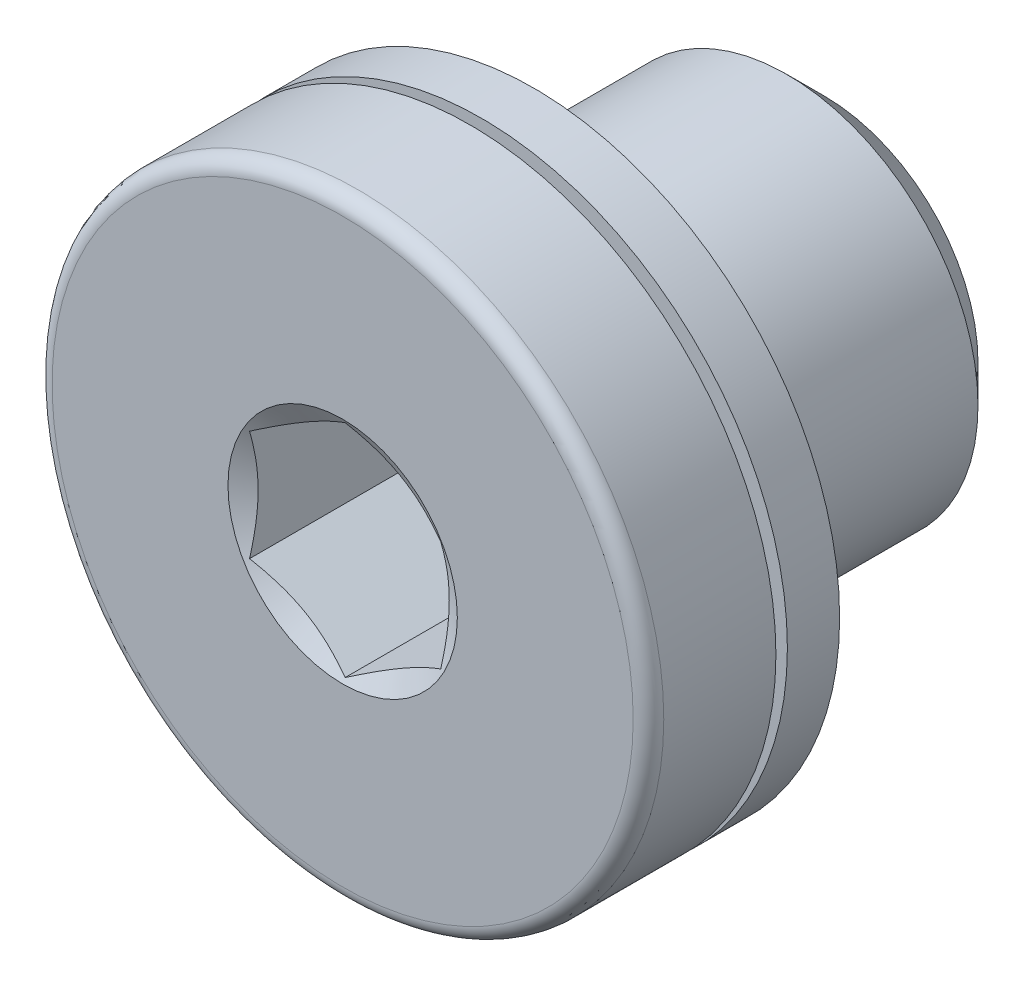
ISO-10303-21;
HEADER;
FILE_DESCRIPTION(('STEP AP214'),'2;1');
FILE_NAME('part.step','',(''),(''),'','','');
FILE_SCHEMA(('AUTOMOTIVE_DESIGN { 1 0 10303 214 1 1 1 1 }'));
ENDSEC;
DATA;
#1=APPLICATION_CONTEXT('core data for automotive mechanical design processes');
#2=APPLICATION_PROTOCOL_DEFINITION('international standard','automotive_design',2000,#1);
#3=PRODUCT_CONTEXT('',#1,'mechanical');
#4=PRODUCT('Part','Part','',(#3));
#5=PRODUCT_RELATED_PRODUCT_CATEGORY('part','',(#4));
#6=PRODUCT_DEFINITION_FORMATION('','',#4);
#7=PRODUCT_DEFINITION_CONTEXT('part definition',#1,'design');
#8=PRODUCT_DEFINITION('design','',#6,#7);
#9=PRODUCT_DEFINITION_SHAPE('','',#8);
#10=(LENGTH_UNIT() NAMED_UNIT(*) SI_UNIT(.MILLI.,.METRE.));
#11=(NAMED_UNIT(*) PLANE_ANGLE_UNIT() SI_UNIT($,.RADIAN.));
#12=(NAMED_UNIT(*) SI_UNIT($,.STERADIAN.) SOLID_ANGLE_UNIT());
#13=UNCERTAINTY_MEASURE_WITH_UNIT(LENGTH_MEASURE(1.E-05),#10,'distance_accuracy_value','');
#14=(GEOMETRIC_REPRESENTATION_CONTEXT(3) GLOBAL_UNCERTAINTY_ASSIGNED_CONTEXT((#13)) GLOBAL_UNIT_ASSIGNED_CONTEXT((#10,
#11,#12)) REPRESENTATION_CONTEXT('',''));
#15=CARTESIAN_POINT('',(0.,0.,0.));
#16=DIRECTION('',(0.,0.,1.));
#17=DIRECTION('',(1.,0.,0.));
#18=AXIS2_PLACEMENT_3D('',#15,#16,#17);
#19=CARTESIAN_POINT('',(0.,0.,2.5));
#20=DIRECTION('',(0.,0.,1.));
#21=DIRECTION('',(1.,0.,0.));
#22=AXIS2_PLACEMENT_3D('',#19,#20,#21);
#23=CONICAL_SURFACE('',#22,1.5,1.04719755119662);
#24=CARTESIAN_POINT('',(0.0002,-1.44349114302794,2.46737460421494));
#25=CARTESIAN_POINT('',(-0.0547333052317653,-1.4117753844649,2.44905384431261));
#26=CARTESIAN_POINT('',(-0.11014078650024,-1.37978586023943,2.43239123574955));
#27=CARTESIAN_POINT('',(-0.221915367600341,-1.31525277575272,2.40330523349468));
#28=CARTESIAN_POINT('',(-0.278284454841711,-1.28270806805994,2.39089213152496));
#29=CARTESIAN_POINT('',(-0.390323974086986,-1.2180220214638,2.37156761718492));
#30=CARTESIAN_POINT('',(-0.445977158459231,-1.18589064048523,2.36452761899634));
#31=CARTESIAN_POINT('',(-0.557545653908394,-1.12147653960457,2.35612036217954));
#32=CARTESIAN_POINT('',(-0.613460558937603,-1.08919405413424,2.35474614475363));
#33=CARTESIAN_POINT('',(-0.717957921181727,-1.02886247391298,2.35759126691683));
#34=CARTESIAN_POINT('',(-0.766555949881317,-1.00080438896119,2.36111202836892));
#35=CARTESIAN_POINT('',(-0.86343536217324,-0.944871034195512,2.37227504224816));
#36=CARTESIAN_POINT('',(-0.911716410192164,-0.916995958125027,2.37992111512158));
#37=CARTESIAN_POINT('',(-1.00879588385404,-0.860947097873551,2.39903738424943));
#38=CARTESIAN_POINT('',(-1.0575820103519,-0.832780414607293,2.41058868652856));
#39=CARTESIAN_POINT('',(-1.1544262522921,-0.776867365453649,2.43680624424279));
#40=CARTESIAN_POINT('',(-1.20248561032696,-0.74912028215514,2.451466331688));
#41=CARTESIAN_POINT('',(-1.2502,-0.721572366433192,2.46737460421492));
#42=B_SPLINE_CURVE_WITH_KNOTS('',3,(#24,#25,#26,#27,#28,#29,#30,#31,#32,#33,#34,#35,#36,#37,#38,
#39,#40,#41),.UNSPECIFIED.,.F.,.F.,(4,2,2,2,2,2,2,2,4),(0.,0.198150821029563,0.396778196315227,
0.59048861735441,0.783961049317196,0.952480056398661,1.12115539730011,1.29357430343591,
1.46565426976932),.UNSPECIFIED.);
#43=CARTESIAN_POINT('',(0.,-1.4433756729741,2.46730792954892));
#44=VERTEX_POINT('',#43);
#45=CARTESIAN_POINT('',(-1.25,-0.72168783648703,2.4673079295489));
#46=VERTEX_POINT('',#45);
#47=EDGE_CURVE('E168',#44,#46,#42,.T.);
#48=ORIENTED_EDGE('',*,*,#47,.T.);
#49=CARTESIAN_POINT('',(-1.25,-1.87874572894168,2.93681578812608));
#50=CARTESIAN_POINT('',(-1.25,-1.82459913302068,2.91079630397451));
#51=CARTESIAN_POINT('',(-1.25,-1.77032166178898,2.88504443226517));
#52=CARTESIAN_POINT('',(-1.25,-1.66143478481926,2.83422768886452));
#53=CARTESIAN_POINT('',(-1.25,-1.60682532215901,2.80916293929029));
#54=CARTESIAN_POINT('',(-1.25,-1.49689322856349,2.75973307534326));
#55=CARTESIAN_POINT('',(-1.25,-1.44156828319314,2.73537308530055));
#56=CARTESIAN_POINT('',(-1.25,-1.33045744440503,2.68773477371074));
#57=CARTESIAN_POINT('',(-1.25,-1.27467157496949,2.66445639629877));
#58=CARTESIAN_POINT('',(-1.25,-1.16103991470961,2.61865938884855));
#59=CARTESIAN_POINT('',(-1.25,-1.10317898167126,2.59617783094599));
#60=CARTESIAN_POINT('',(-1.25,-0.986771125105983,2.55307334414044));
#61=CARTESIAN_POINT('',(-1.25,-0.928224116523322,2.5324506485031));
#62=CARTESIAN_POINT('',(-1.25,-0.751645593411336,2.47423400437964));
#63=CARTESIAN_POINT('',(-1.25,-0.6323555808323,2.44015611590166));
#64=CARTESIAN_POINT('',(-1.25,-0.45116473849796,2.40056175977571));
#65=CARTESIAN_POINT('',(-1.25,-0.390526459363069,2.3892961625641));
#66=CARTESIAN_POINT('',(-1.25,-0.268559609070198,2.37134572474735));
#67=CARTESIAN_POINT('',(-1.25,-0.207231087371658,2.36466055802818));
#68=CARTESIAN_POINT('',(-1.25,-0.084966050685076,2.35648952204454));
#69=CARTESIAN_POINT('',(-1.25,-0.0240337887366344,2.35494164073779));
#70=CARTESIAN_POINT('',(-1.25,0.0977411791636478,2.35701041163861));
#71=CARTESIAN_POINT('',(-1.25,0.158583879563683,2.36062737154196));
#72=CARTESIAN_POINT('',(-1.25,0.308250226749134,2.37555891687979));
#73=CARTESIAN_POINT('',(-1.25,0.396792908586709,2.38969120089228));
#74=CARTESIAN_POINT('',(-1.25,0.57216953082706,2.42625541428785));
#75=CARTESIAN_POINT('',(-1.25,0.65900129656399,2.44869726858717));
#76=CARTESIAN_POINT('',(-1.25,0.788874180686678,2.48708761722013));
#77=CARTESIAN_POINT('',(-1.25,0.832585616783459,2.50085255945313));
#78=CARTESIAN_POINT('',(-1.25,0.919553498508186,2.52966970299115));
#79=CARTESIAN_POINT('',(-1.25,0.962810208444102,2.5447211041039));
#80=CARTESIAN_POINT('',(-1.25,1.04892603992316,2.57589128206207));
#81=CARTESIAN_POINT('',(-1.25,1.091785229078,2.59200987345469));
#82=CARTESIAN_POINT('',(-1.25,1.17716476887543,2.62513864976078));
#83=CARTESIAN_POINT('',(-1.25,1.21968506130426,2.64214898420581));
#84=CARTESIAN_POINT('',(-1.25,1.32891773604273,2.68695476047892));
#85=CARTESIAN_POINT('',(-1.25,1.39540440406978,2.71529990691633));
#86=CARTESIAN_POINT('',(-1.25,1.52776931254681,2.7733807400096));
#87=CARTESIAN_POINT('',(-1.25,1.59364750509838,2.80311653503706));
#88=CARTESIAN_POINT('',(-1.25,1.79057413329795,2.89391625928371));
#89=CARTESIAN_POINT('',(-1.25,1.92089140258712,2.95656271452606));
#90=CARTESIAN_POINT('',(-1.25,2.1804053543048,3.08450957970613));
#91=CARTESIAN_POINT('',(-1.25,2.30960041542491,3.14981323843585));
#92=CARTESIAN_POINT('',(-1.25,2.56709912603386,3.2821101646199));
#93=CARTESIAN_POINT('',(-1.25,2.69540289097166,3.34910320784087));
#94=CARTESIAN_POINT('',(-1.25,2.93915409594417,3.47778801998874));
#95=CARTESIAN_POINT('',(-1.25,3.05465756005898,3.53937404309921));
#96=CARTESIAN_POINT('',(-1.25,3.28529256409585,3.66324868838368));
#97=CARTESIAN_POINT('',(-1.25,3.40042408942658,3.72553733770159));
#98=CARTESIAN_POINT('',(-1.25,3.63010096677233,3.8504772588485));
#99=CARTESIAN_POINT('',(-1.25,3.7446470644513,3.91312716176761));
#100=CARTESIAN_POINT('',(-1.25,3.97350758740994,4.03883424336428));
#101=CARTESIAN_POINT('',(-1.25,4.08782202487979,4.10189139984006));
#102=CARTESIAN_POINT('',(-1.25,4.20205341997672,4.1650977292889));
#103=B_SPLINE_CURVE_WITH_KNOTS('',3,(#49,#50,#51,#52,#53,#54,#55,#56,#57,#58,#59,#60,#61,#62,
#63,#64,#65,#66,#67,#68,#69,#70,#71,#72,#73,#74,#75,#76,#77,#78,#79,#80,#81,#82,#83,#84,#85,#86,
#87,#88,#89,#90,#91,#92,#93,#94,#95,#96,#97,#98,#99,#100,#101,#102),.UNSPECIFIED.,.F.,.F.,(4,2,
2,2,2,2,2,2,2,2,2,2,2,2,2,2,2,2,2,2,2,2,2,2,2,2,4),(0.,0.180223813235836,0.360479451335505,
0.541820978833653,0.723153129678814,0.909344209300997,1.09555862131016,1.46694391400965,
1.65183212771014,1.83670717651117,2.01934232620658,2.2019883568583,2.4704270788046,
2.73918746255963,2.87665477201853,3.01403718896907,3.15139579440046,3.28877750688833,
3.50558451839347,3.72240845365891,4.15613189915053,4.59040257758367,5.02461591520003,
5.4173026103609,5.81000452814319,6.20168255127467,6.5933393990069),.UNSPECIFIED.);
#104=CARTESIAN_POINT('',(-1.25,0.72168783648703,2.4673079295489));
#105=VERTEX_POINT('',#104);
#106=EDGE_CURVE('E11',#46,#105,#103,.T.);
#107=ORIENTED_EDGE('',*,*,#106,.T.);
#108=CARTESIAN_POINT('',(-1.2502,0.721572366433192,2.46737460421492));
#109=CARTESIAN_POINT('',(-1.19526669476824,0.753288124996229,2.44905384431259));
#110=CARTESIAN_POINT('',(-1.13985921349976,0.785277649221703,2.43239123574954));
#111=CARTESIAN_POINT('',(-1.02808463239966,0.849810733708406,2.40330523349467));
#112=CARTESIAN_POINT('',(-0.971715545158294,0.882355441401186,2.39089213152495));
#113=CARTESIAN_POINT('',(-0.859676025913022,0.947041487997323,2.37156761718492));
#114=CARTESIAN_POINT('',(-0.804022841540778,0.9791728689759,2.36452761899634));
#115=CARTESIAN_POINT('',(-0.692454346091618,1.04358696985656,2.35612036217954));
#116=CARTESIAN_POINT('',(-0.63653944106241,1.07586945532688,2.35474614475363));
#117=CARTESIAN_POINT('',(-0.532042078818285,1.13620103554814,2.35759126691683));
#118=CARTESIAN_POINT('',(-0.483444050118694,1.16425912049993,2.36111202836893));
#119=CARTESIAN_POINT('',(-0.386564637826769,1.22019247526561,2.37227504224817));
#120=CARTESIAN_POINT('',(-0.338283589807843,1.2480675513361,2.37992111512159));
#121=CARTESIAN_POINT('',(-0.241204116145962,1.30411641158758,2.39903738424945));
#122=CARTESIAN_POINT('',(-0.192417989648104,1.33228309485383,2.41058868652857));
#123=CARTESIAN_POINT('',(-0.0955737477079001,1.38819614400748,2.43680624424281));
#124=CARTESIAN_POINT('',(-0.0475143896730371,1.41594322730599,2.45146633168802));
#125=CARTESIAN_POINT('',(0.000199999999999691,1.44349114302794,2.46737460421494));
#126=B_SPLINE_CURVE_WITH_KNOTS('',3,(#108,#109,#110,#111,#112,#113,#114,#115,#116,#117,#118,
#119,#120,#121,#122,#123,#124,#125),.UNSPECIFIED.,.F.,.F.,(4,2,2,2,2,2,2,2,4),(0.,
0.198150821029558,0.396778196315218,0.590488617354396,0.783961049317176,0.952480056398646,
1.1211553973001,1.29357430343591,1.46565426976932),.UNSPECIFIED.);
#127=CARTESIAN_POINT('',(0.,1.4433756729741,2.46730792954892));
#128=VERTEX_POINT('',#127);
#129=EDGE_CURVE('E48',#105,#128,#126,.T.);
#130=ORIENTED_EDGE('',*,*,#129,.T.);
#131=CARTESIAN_POINT('',(-0.0002,1.44349114302794,2.46737460421494));
#132=CARTESIAN_POINT('',(0.0547333052317653,1.4117753844649,2.44905384431261));
#133=CARTESIAN_POINT('',(0.11014078650024,1.37978586023943,2.43239123574955));
#134=CARTESIAN_POINT('',(0.221915367600341,1.31525277575272,2.40330523349468));
#135=CARTESIAN_POINT('',(0.278284454841711,1.28270806805994,2.39089213152496));
#136=CARTESIAN_POINT('',(0.390323974086986,1.2180220214638,2.37156761718492));
#137=CARTESIAN_POINT('',(0.445977158459231,1.18589064048523,2.36452761899634));
#138=CARTESIAN_POINT('',(0.557545653908394,1.12147653960457,2.35612036217954));
#139=CARTESIAN_POINT('',(0.613460558937603,1.08919405413424,2.35474614475363));
#140=CARTESIAN_POINT('',(0.717957921181727,1.02886247391298,2.35759126691683));
#141=CARTESIAN_POINT('',(0.766555949881317,1.00080438896119,2.36111202836892));
#142=CARTESIAN_POINT('',(0.86343536217324,0.944871034195512,2.37227504224816));
#143=CARTESIAN_POINT('',(0.911716410192164,0.916995958125027,2.37992111512158));
#144=CARTESIAN_POINT('',(1.00879588385404,0.860947097873551,2.39903738424943));
#145=CARTESIAN_POINT('',(1.0575820103519,0.832780414607293,2.41058868652856));
#146=CARTESIAN_POINT('',(1.1544262522921,0.776867365453649,2.43680624424279));
#147=CARTESIAN_POINT('',(1.20248561032696,0.74912028215514,2.451466331688));
#148=CARTESIAN_POINT('',(1.2502,0.721572366433192,2.46737460421492));
#149=B_SPLINE_CURVE_WITH_KNOTS('',3,(#131,#132,#133,#134,#135,#136,#137,#138,#139,#140,#141,
#142,#143,#144,#145,#146,#147,#148),.UNSPECIFIED.,.F.,.F.,(4,2,2,2,2,2,2,2,4),(0.,
0.198150821029563,0.396778196315227,0.59048861735441,0.783961049317196,0.952480056398661,
1.12115539730011,1.29357430343591,1.46565426976932),.UNSPECIFIED.);
#150=CARTESIAN_POINT('',(1.25,0.72168783648703,2.4673079295489));
#151=VERTEX_POINT('',#150);
#152=EDGE_CURVE('E276',#128,#151,#149,.T.);
#153=ORIENTED_EDGE('',*,*,#152,.T.);
#154=CARTESIAN_POINT('',(1.25,-1.87874572894168,2.93681578812608));
#155=CARTESIAN_POINT('',(1.25,-1.82459913302068,2.91079630397451));
#156=CARTESIAN_POINT('',(1.25,-1.77032166178898,2.88504443226517));
#157=CARTESIAN_POINT('',(1.25,-1.66143478481926,2.83422768886452));
#158=CARTESIAN_POINT('',(1.25,-1.60682532215901,2.80916293929029));
#159=CARTESIAN_POINT('',(1.25,-1.49689322856349,2.75973307534326));
#160=CARTESIAN_POINT('',(1.25,-1.44156828319314,2.73537308530055));
#161=CARTESIAN_POINT('',(1.25,-1.33045744440503,2.68773477371074));
#162=CARTESIAN_POINT('',(1.25,-1.27467157496949,2.66445639629877));
#163=CARTESIAN_POINT('',(1.25,-1.16103991470961,2.61865938884855));
#164=CARTESIAN_POINT('',(1.25,-1.10317898167126,2.59617783094599));
#165=CARTESIAN_POINT('',(1.25,-0.986771125105983,2.55307334414044));
#166=CARTESIAN_POINT('',(1.25,-0.928224116523322,2.5324506485031));
#167=CARTESIAN_POINT('',(1.25,-0.751645593411336,2.47423400437964));
#168=CARTESIAN_POINT('',(1.25,-0.6323555808323,2.44015611590166));
#169=CARTESIAN_POINT('',(1.25,-0.45116473849796,2.40056175977571));
#170=CARTESIAN_POINT('',(1.25,-0.390526459363069,2.3892961625641));
#171=CARTESIAN_POINT('',(1.25,-0.268559609070198,2.37134572474735));
#172=CARTESIAN_POINT('',(1.25,-0.207231087371658,2.36466055802818));
#173=CARTESIAN_POINT('',(1.25,-0.084966050685076,2.35648952204454));
#174=CARTESIAN_POINT('',(1.25,-0.0240337887366344,2.35494164073779));
#175=CARTESIAN_POINT('',(1.25,0.0977411791636478,2.35701041163861));
#176=CARTESIAN_POINT('',(1.25,0.158583879563683,2.36062737154196));
#177=CARTESIAN_POINT('',(1.25,0.308250226749134,2.37555891687979));
#178=CARTESIAN_POINT('',(1.25,0.396792908586709,2.38969120089228));
#179=CARTESIAN_POINT('',(1.25,0.57216953082706,2.42625541428785));
#180=CARTESIAN_POINT('',(1.25,0.65900129656399,2.44869726858717));
#181=CARTESIAN_POINT('',(1.25,0.788874180686678,2.48708761722013));
#182=CARTESIAN_POINT('',(1.25,0.832585616783459,2.50085255945313));
#183=CARTESIAN_POINT('',(1.25,0.919553498508186,2.52966970299115));
#184=CARTESIAN_POINT('',(1.25,0.962810208444102,2.5447211041039));
#185=CARTESIAN_POINT('',(1.25,1.04892603992316,2.57589128206207));
#186=CARTESIAN_POINT('',(1.25,1.091785229078,2.59200987345469));
#187=CARTESIAN_POINT('',(1.25,1.17716476887543,2.62513864976078));
#188=CARTESIAN_POINT('',(1.25,1.21968506130426,2.64214898420581));
#189=CARTESIAN_POINT('',(1.25,1.32891773604273,2.68695476047892));
#190=CARTESIAN_POINT('',(1.25,1.39540440406978,2.71529990691633));
#191=CARTESIAN_POINT('',(1.25,1.52776931254681,2.7733807400096));
#192=CARTESIAN_POINT('',(1.25,1.59364750509838,2.80311653503706));
#193=CARTESIAN_POINT('',(1.25,1.79057413329795,2.89391625928371));
#194=CARTESIAN_POINT('',(1.25,1.92089140258712,2.95656271452606));
#195=CARTESIAN_POINT('',(1.25,2.1804053543048,3.08450957970613));
#196=CARTESIAN_POINT('',(1.25,2.30960041542491,3.14981323843585));
#197=CARTESIAN_POINT('',(1.25,2.56709912603386,3.2821101646199));
#198=CARTESIAN_POINT('',(1.25,2.69540289097166,3.34910320784087));
#199=CARTESIAN_POINT('',(1.25,2.93915409594417,3.47778801998874));
#200=CARTESIAN_POINT('',(1.25,3.05465756005898,3.53937404309921));
#201=CARTESIAN_POINT('',(1.25,3.28529256409585,3.66324868838368));
#202=CARTESIAN_POINT('',(1.25,3.40042408942658,3.72553733770159));
#203=CARTESIAN_POINT('',(1.25,3.63010096677233,3.8504772588485));
#204=CARTESIAN_POINT('',(1.25,3.7446470644513,3.91312716176761));
#205=CARTESIAN_POINT('',(1.25,3.97350758740994,4.03883424336428));
#206=CARTESIAN_POINT('',(1.25,4.08782202487979,4.10189139984006));
#207=CARTESIAN_POINT('',(1.25,4.20205341997672,4.1650977292889));
#208=B_SPLINE_CURVE_WITH_KNOTS('',3,(#154,#155,#156,#157,#158,#159,#160,#161,#162,#163,#164,
#165,#166,#167,#168,#169,#170,#171,#172,#173,#174,#175,#176,#177,#178,#179,#180,#181,#182,#183,
#184,#185,#186,#187,#188,#189,#190,#191,#192,#193,#194,#195,#196,#197,#198,#199,#200,#201,#202,
#203,#204,#205,#206,#207),.UNSPECIFIED.,.F.,.F.,(4,2,2,2,2,2,2,2,2,2,2,2,2,2,2,2,2,2,2,2,2,2,2,
2,2,2,4),(0.,0.180223813235836,0.360479451335505,0.541820978833653,0.723153129678814,
0.909344209300997,1.09555862131016,1.46694391400965,1.65183212771014,1.83670717651117,
2.01934232620658,2.2019883568583,2.4704270788046,2.73918746255963,2.87665477201853,
3.01403718896907,3.15139579440046,3.28877750688833,3.50558451839347,3.72240845365891,
4.15613189915053,4.59040257758367,5.02461591520003,5.4173026103609,5.81000452814319,
6.20168255127467,6.5933393990069),.UNSPECIFIED.);
#209=CARTESIAN_POINT('',(1.25,-0.72168783648703,2.4673079295489));
#210=VERTEX_POINT('',#209);
#211=EDGE_CURVE('E272',#151,#210,#208,.F.);
#212=ORIENTED_EDGE('',*,*,#211,.T.);
#213=CARTESIAN_POINT('',(1.2502,-0.721572366433192,2.46737460421492));
#214=CARTESIAN_POINT('',(1.19526669476824,-0.753288124996229,2.44905384431259));
#215=CARTESIAN_POINT('',(1.13985921349976,-0.785277649221703,2.43239123574954));
#216=CARTESIAN_POINT('',(1.02808463239966,-0.849810733708406,2.40330523349467));
#217=CARTESIAN_POINT('',(0.971715545158294,-0.882355441401186,2.39089213152495));
#218=CARTESIAN_POINT('',(0.859676025913022,-0.947041487997323,2.37156761718492));
#219=CARTESIAN_POINT('',(0.804022841540778,-0.9791728689759,2.36452761899634));
#220=CARTESIAN_POINT('',(0.692454346091618,-1.04358696985656,2.35612036217954));
#221=CARTESIAN_POINT('',(0.63653944106241,-1.07586945532688,2.35474614475363));
#222=CARTESIAN_POINT('',(0.532042078818285,-1.13620103554814,2.35759126691683));
#223=CARTESIAN_POINT('',(0.483444050118694,-1.16425912049993,2.36111202836893));
#224=CARTESIAN_POINT('',(0.386564637826769,-1.22019247526561,2.37227504224817));
#225=CARTESIAN_POINT('',(0.338283589807843,-1.2480675513361,2.37992111512159));
#226=CARTESIAN_POINT('',(0.241204116145962,-1.30411641158758,2.39903738424945));
#227=CARTESIAN_POINT('',(0.192417989648104,-1.33228309485383,2.41058868652857));
#228=CARTESIAN_POINT('',(0.0955737477079001,-1.38819614400748,2.43680624424281));
#229=CARTESIAN_POINT('',(0.0475143896730371,-1.41594322730599,2.45146633168802));
#230=CARTESIAN_POINT('',(-0.000199999999999691,-1.44349114302794,2.46737460421494));
#231=B_SPLINE_CURVE_WITH_KNOTS('',3,(#213,#214,#215,#216,#217,#218,#219,#220,#221,#222,#223,
#224,#225,#226,#227,#228,#229,#230),.UNSPECIFIED.,.F.,.F.,(4,2,2,2,2,2,2,2,4),(0.,
0.198150821029558,0.396778196315218,0.590488617354396,0.783961049317176,0.952480056398646,
1.1211553973001,1.29357430343591,1.46565426976932),.UNSPECIFIED.);
#232=EDGE_CURVE('E174',#210,#44,#231,.T.);
#233=ORIENTED_EDGE('',*,*,#232,.T.);
#234=EDGE_LOOP('',(#48,#107,#130,#153,#212,#233));
#235=FACE_BOUND('',#234,.T.);
#236=CARTESIAN_POINT('',(0.,0.,2.5));
#237=DIRECTION('',(0.,0.,1.));
#238=DIRECTION('',(1.,0.,0.));
#239=AXIS2_PLACEMENT_3D('',#236,#237,#238);
#240=CIRCLE('',#239,1.5);
#241=CARTESIAN_POINT('',(1.5,0.,2.5));
#242=VERTEX_POINT('',#241);
#243=EDGE_CURVE('E165',#242,#242,#240,.T.);
#244=ORIENTED_EDGE('',*,*,#243,.T.);
#245=EDGE_LOOP('',(#244));
#246=FACE_BOUND('',#245,.T.);
#247=ADVANCED_FACE('F36',(#235,#246),#23,.F.);
#248=CARTESIAN_POINT('',(0.,1.5,2.5));
#249=DIRECTION('',(0.,0.,-1.));
#250=DIRECTION('',(-1.,0.,0.));
#251=AXIS2_PLACEMENT_3D('',#248,#249,#250);
#252=PLANE('',#251);
#253=ORIENTED_EDGE('',*,*,#243,.F.);
#254=EDGE_LOOP('',(#253));
#255=FACE_BOUND('',#254,.T.);
#256=CARTESIAN_POINT('',(0.,0.,2.5));
#257=DIRECTION('',(0.,0.,1.));
#258=DIRECTION('',(1.,0.,0.));
#259=AXIS2_PLACEMENT_3D('',#256,#257,#258);
#260=CIRCLE('',#259,3.8);
#261=CARTESIAN_POINT('',(3.8,0.,2.5));
#262=VERTEX_POINT('',#261);
#263=EDGE_CURVE('E162',#262,#262,#260,.T.);
#264=ORIENTED_EDGE('',*,*,#263,.T.);
#265=EDGE_LOOP('',(#264));
#266=FACE_BOUND('',#265,.T.);
#267=ADVANCED_FACE('F231',(#255,#266),#252,.F.);
#268=CARTESIAN_POINT('',(0.,0.,2.29999999999997));
#269=DIRECTION('',(0.,0.,1.));
#270=DIRECTION('',(1.,0.,0.));
#271=AXIS2_PLACEMENT_3D('',#268,#269,#270);
#272=TOROIDAL_SURFACE('',#271,3.79999999999997,0.200000000000032);
#273=ORIENTED_EDGE('',*,*,#263,.F.);
#274=EDGE_LOOP('',(#273));
#275=FACE_BOUND('',#274,.T.);
#276=CARTESIAN_POINT('',(0.,0.,2.3));
#277=DIRECTION('',(0.,0.,1.));
#278=DIRECTION('',(1.,0.,0.));
#279=AXIS2_PLACEMENT_3D('',#276,#277,#278);
#280=CIRCLE('',#279,4.);
#281=CARTESIAN_POINT('',(4.,0.,2.3));
#282=VERTEX_POINT('',#281);
#283=EDGE_CURVE('E159',#282,#282,#280,.T.);
#284=ORIENTED_EDGE('',*,*,#283,.T.);
#285=EDGE_LOOP('',(#284));
#286=FACE_BOUND('',#285,.T.);
#287=ADVANCED_FACE('F228',(#275,#286),#272,.T.);
#288=CARTESIAN_POINT('',(0.,0.,-3.8));
#289=DIRECTION('',(0.,0.,1.));
#290=DIRECTION('',(1.,0.,0.));
#291=AXIS2_PLACEMENT_3D('',#288,#289,#290);
#292=CYLINDRICAL_SURFACE('',#291,4.);
#293=ORIENTED_EDGE('',*,*,#283,.F.);
#294=EDGE_LOOP('',(#293));
#295=FACE_BOUND('',#294,.T.);
#296=CARTESIAN_POINT('',(0.,0.,0.83333333333333));
#297=DIRECTION('',(0.,0.,1.));
#298=DIRECTION('',(1.,0.,0.));
#299=AXIS2_PLACEMENT_3D('',#296,#297,#298);
#300=CIRCLE('',#299,4.);
#301=CARTESIAN_POINT('',(4.,0.,0.83333333333333));
#302=VERTEX_POINT('',#301);
#303=EDGE_CURVE('E156',#302,#302,#300,.T.);
#304=ORIENTED_EDGE('',*,*,#303,.T.);
#305=EDGE_LOOP('',(#304));
#306=FACE_BOUND('',#305,.T.);
#307=ADVANCED_FACE('F224',(#295,#306),#292,.T.);
#308=CARTESIAN_POINT('',(0.,4.,0.83333333333333));
#309=DIRECTION('',(0.,0.,1.));
#310=DIRECTION('',(1.,0.,0.));
#311=AXIS2_PLACEMENT_3D('',#308,#309,#310);
#312=PLANE('',#311);
#313=ORIENTED_EDGE('',*,*,#303,.F.);
#314=EDGE_LOOP('',(#313));
#315=FACE_BOUND('',#314,.T.);
#316=CARTESIAN_POINT('',(0.,0.,0.83333333333333));
#317=DIRECTION('',(0.,0.,1.));
#318=DIRECTION('',(1.,0.,0.));
#319=AXIS2_PLACEMENT_3D('',#316,#317,#318);
#320=CIRCLE('',#319,3.6);
#321=CARTESIAN_POINT('',(3.6,0.,0.83333333333333));
#322=VERTEX_POINT('',#321);
#323=EDGE_CURVE('E153',#322,#322,#320,.T.);
#324=ORIENTED_EDGE('',*,*,#323,.T.);
#325=EDGE_LOOP('',(#324));
#326=FACE_BOUND('',#325,.T.);
#327=ADVANCED_FACE('F220',(#315,#326),#312,.F.);
#328=CARTESIAN_POINT('',(0.,0.,-3.8));
#329=DIRECTION('',(0.,0.,1.));
#330=DIRECTION('',(1.,0.,0.));
#331=AXIS2_PLACEMENT_3D('',#328,#329,#330);
#332=CYLINDRICAL_SURFACE('',#331,3.6);
#333=ORIENTED_EDGE('',*,*,#323,.F.);
#334=EDGE_LOOP('',(#333));
#335=FACE_BOUND('',#334,.T.);
#336=CARTESIAN_POINT('',(0.,0.,0.68333333333333));
#337=DIRECTION('',(0.,0.,1.));
#338=DIRECTION('',(1.,0.,0.));
#339=AXIS2_PLACEMENT_3D('',#336,#337,#338);
#340=CIRCLE('',#339,3.6);
#341=CARTESIAN_POINT('',(3.6,0.,0.68333333333333));
#342=VERTEX_POINT('',#341);
#343=EDGE_CURVE('E150',#342,#342,#340,.T.);
#344=ORIENTED_EDGE('',*,*,#343,.T.);
#345=EDGE_LOOP('',(#344));
#346=FACE_BOUND('',#345,.T.);
#347=ADVANCED_FACE('F216',(#335,#346),#332,.T.);
#348=CARTESIAN_POINT('',(0.,3.6,0.68333333333333));
#349=DIRECTION('',(0.,0.,-1.));
#350=DIRECTION('',(-1.,0.,0.));
#351=AXIS2_PLACEMENT_3D('',#348,#349,#350);
#352=PLANE('',#351);
#353=ORIENTED_EDGE('',*,*,#343,.F.);
#354=EDGE_LOOP('',(#353));
#355=FACE_BOUND('',#354,.T.);
#356=CARTESIAN_POINT('',(0.,0.,0.68333333333333));
#357=DIRECTION('',(0.,0.,1.));
#358=DIRECTION('',(1.,0.,0.));
#359=AXIS2_PLACEMENT_3D('',#356,#357,#358);
#360=CIRCLE('',#359,4.);
#361=CARTESIAN_POINT('',(4.,0.,0.68333333333333));
#362=VERTEX_POINT('',#361);
#363=EDGE_CURVE('E147',#362,#362,#360,.T.);
#364=ORIENTED_EDGE('',*,*,#363,.T.);
#365=EDGE_LOOP('',(#364));
#366=FACE_BOUND('',#365,.T.);
#367=ADVANCED_FACE('F212',(#355,#366),#352,.F.);
#368=CARTESIAN_POINT('',(0.,0.,-3.8));
#369=DIRECTION('',(0.,0.,1.));
#370=DIRECTION('',(1.,0.,0.));
#371=AXIS2_PLACEMENT_3D('',#368,#369,#370);
#372=CYLINDRICAL_SURFACE('',#371,4.);
#373=ORIENTED_EDGE('',*,*,#363,.F.);
#374=EDGE_LOOP('',(#373));
#375=FACE_BOUND('',#374,.T.);
#376=CARTESIAN_POINT('',(0.,0.,0.));
#377=DIRECTION('',(0.,0.,1.));
#378=DIRECTION('',(1.,0.,0.));
#379=AXIS2_PLACEMENT_3D('',#376,#377,#378);
#380=CIRCLE('',#379,4.);
#381=CARTESIAN_POINT('',(4.,0.,0.));
#382=VERTEX_POINT('',#381);
#383=EDGE_CURVE('E144',#382,#382,#380,.T.);
#384=ORIENTED_EDGE('',*,*,#383,.T.);
#385=EDGE_LOOP('',(#384));
#386=FACE_BOUND('',#385,.T.);
#387=ADVANCED_FACE('F208',(#375,#386),#372,.T.);
#388=CARTESIAN_POINT('',(0.,4.,0.));
#389=DIRECTION('',(0.,0.,1.));
#390=DIRECTION('',(1.,0.,0.));
#391=AXIS2_PLACEMENT_3D('',#388,#389,#390);
#392=PLANE('',#391);
#393=ORIENTED_EDGE('',*,*,#383,.F.);
#394=EDGE_LOOP('',(#393));
#395=FACE_BOUND('',#394,.T.);
#396=CARTESIAN_POINT('',(0.,0.,0.));
#397=DIRECTION('',(0.,0.,1.));
#398=DIRECTION('',(1.,0.,0.));
#399=AXIS2_PLACEMENT_3D('',#396,#397,#398);
#400=CIRCLE('',#399,2.0095);
#401=CARTESIAN_POINT('',(2.0095,0.,0.));
#402=VERTEX_POINT('',#401);
#403=EDGE_CURVE('E141',#402,#402,#400,.T.);
#404=ORIENTED_EDGE('',*,*,#403,.T.);
#405=EDGE_LOOP('',(#404));
#406=FACE_BOUND('',#405,.T.);
#407=ADVANCED_FACE('F204',(#395,#406),#392,.F.);
#408=CARTESIAN_POINT('',(0.,0.,-0.4905));
#409=DIRECTION('',(0.,0.,-1.));
#410=DIRECTION('',(-1.,0.,0.));
#411=AXIS2_PLACEMENT_3D('',#408,#409,#410);
#412=CONICAL_SURFACE('',#411,2.5,0.785398163397448);
#413=ORIENTED_EDGE('',*,*,#403,.F.);
#414=EDGE_LOOP('',(#413));
#415=FACE_BOUND('',#414,.T.);
#416=CARTESIAN_POINT('',(0.,0.,-0.4905));
#417=DIRECTION('',(0.,0.,1.));
#418=DIRECTION('',(1.,0.,0.));
#419=AXIS2_PLACEMENT_3D('',#416,#417,#418);
#420=CIRCLE('',#419,2.5);
#421=CARTESIAN_POINT('',(2.5,0.,-0.4905));
#422=VERTEX_POINT('',#421);
#423=EDGE_CURVE('E138',#422,#422,#420,.T.);
#424=ORIENTED_EDGE('',*,*,#423,.T.);
#425=EDGE_LOOP('',(#424));
#426=FACE_BOUND('',#425,.T.);
#427=ADVANCED_FACE('F200',(#415,#426),#412,.T.);
#428=CARTESIAN_POINT('',(0.,0.,-3.8));
#429=DIRECTION('',(0.,0.,1.));
#430=DIRECTION('',(1.,0.,0.));
#431=AXIS2_PLACEMENT_3D('',#428,#429,#430);
#432=CYLINDRICAL_SURFACE('',#431,2.5);
#433=ORIENTED_EDGE('',*,*,#423,.F.);
#434=EDGE_LOOP('',(#433));
#435=FACE_BOUND('',#434,.T.);
#436=CARTESIAN_POINT('',(0.,0.,-3.3095));
#437=DIRECTION('',(0.,0.,1.));
#438=DIRECTION('',(1.,0.,0.));
#439=AXIS2_PLACEMENT_3D('',#436,#437,#438);
#440=CIRCLE('',#439,2.5);
#441=CARTESIAN_POINT('',(2.5,0.,-3.3095));
#442=VERTEX_POINT('',#441);
#443=EDGE_CURVE('E135',#442,#442,#440,.T.);
#444=ORIENTED_EDGE('',*,*,#443,.T.);
#445=EDGE_LOOP('',(#444));
#446=FACE_BOUND('',#445,.T.);
#447=ADVANCED_FACE('F196',(#435,#446),#432,.T.);
#448=CARTESIAN_POINT('',(0.,0.,-3.8));
#449=DIRECTION('',(0.,0.,1.));
#450=DIRECTION('',(1.,0.,0.));
#451=AXIS2_PLACEMENT_3D('',#448,#449,#450);
#452=CONICAL_SURFACE('',#451,2.0095,0.785398163397448);
#453=ORIENTED_EDGE('',*,*,#443,.F.);
#454=EDGE_LOOP('',(#453));
#455=FACE_BOUND('',#454,.T.);
#456=CARTESIAN_POINT('',(0.,0.,-3.8));
#457=DIRECTION('',(0.,0.,1.));
#458=DIRECTION('',(1.,0.,0.));
#459=AXIS2_PLACEMENT_3D('',#456,#457,#458);
#460=CIRCLE('',#459,2.0095);
#461=CARTESIAN_POINT('',(2.0095,0.,-3.8));
#462=VERTEX_POINT('',#461);
#463=EDGE_CURVE('E123',#462,#462,#460,.T.);
#464=ORIENTED_EDGE('',*,*,#463,.T.);
#465=EDGE_LOOP('',(#464));
#466=FACE_BOUND('',#465,.T.);
#467=ADVANCED_FACE('F192',(#455,#466),#452,.T.);
#468=CARTESIAN_POINT('',(0.,2.0095,-3.8));
#469=DIRECTION('',(0.,0.,1.));
#470=DIRECTION('',(1.,0.,0.));
#471=AXIS2_PLACEMENT_3D('',#468,#469,#470);
#472=PLANE('',#471);
#473=ORIENTED_EDGE('',*,*,#463,.F.);
#474=EDGE_LOOP('',(#473));
#475=FACE_BOUND('',#474,.T.);
#476=ADVANCED_FACE('F189',(#475),#472,.F.);
#477=CARTESIAN_POINT('',(-1.25,0.72168783648703,0.));
#478=DIRECTION('',(-1.,0.,0.));
#479=DIRECTION('',(0.,0.,1.));
#480=AXIS2_PLACEMENT_3D('',#477,#478,#479);
#481=PLANE('',#480);
#482=DIRECTION('',(0.,0.,1.));
#483=VECTOR('',#482,1.);
#484=CARTESIAN_POINT('',(-1.25,-0.72168783648703,0.));
#485=LINE('',#484,#483);
#486=CARTESIAN_POINT('',(-1.25,-0.72168783648703,0.));
#487=VERTEX_POINT('',#486);
#488=EDGE_CURVE('E55',#487,#46,#485,.T.);
#489=ORIENTED_EDGE('',*,*,#488,.F.);
#490=DIRECTION('',(0.,-1.,0.));
#491=VECTOR('',#490,1.);
#492=CARTESIAN_POINT('',(-1.25,0.72168783648703,0.));
#493=LINE('',#492,#491);
#494=CARTESIAN_POINT('',(-1.25,0.72168783648703,0.));
#495=VERTEX_POINT('',#494);
#496=EDGE_CURVE('E94',#495,#487,#493,.T.);
#497=ORIENTED_EDGE('',*,*,#496,.F.);
#498=DIRECTION('',(0.,0.,1.));
#499=VECTOR('',#498,1.);
#500=CARTESIAN_POINT('',(-1.25,0.72168783648703,0.));
#501=LINE('',#500,#499);
#502=EDGE_CURVE('E121',#495,#105,#501,.T.);
#503=ORIENTED_EDGE('',*,*,#502,.T.);
#504=ORIENTED_EDGE('',*,*,#106,.F.);
#505=EDGE_LOOP('',(#489,#497,#503,#504));
#506=FACE_BOUND('',#505,.T.);
#507=ADVANCED_FACE('F92',(#506),#481,.F.);
#508=CARTESIAN_POINT('',(0.,1.4433756729741,0.));
#509=DIRECTION('',(-0.50000000000002,0.866025403784427,0.));
#510=DIRECTION('',(-0.866025403784427,-0.50000000000002,0.));
#511=AXIS2_PLACEMENT_3D('',#508,#509,#510);
#512=PLANE('',#511);
#513=ORIENTED_EDGE('',*,*,#502,.F.);
#514=DIRECTION('',(-0.866025403784427,-0.50000000000002,0.));
#515=VECTOR('',#514,1.);
#516=CARTESIAN_POINT('',(0.,1.4433756729741,0.));
#517=LINE('',#516,#515);
#518=CARTESIAN_POINT('',(0.,1.4433756729741,0.));
#519=VERTEX_POINT('',#518);
#520=EDGE_CURVE('E98',#519,#495,#517,.T.);
#521=ORIENTED_EDGE('',*,*,#520,.F.);
#522=DIRECTION('',(0.,0.,1.));
#523=VECTOR('',#522,1.);
#524=CARTESIAN_POINT('',(0.,1.4433756729741,0.));
#525=LINE('',#524,#523);
#526=EDGE_CURVE('E124',#519,#128,#525,.T.);
#527=ORIENTED_EDGE('',*,*,#526,.T.);
#528=ORIENTED_EDGE('',*,*,#129,.F.);
#529=EDGE_LOOP('',(#513,#521,#527,#528));
#530=FACE_BOUND('',#529,.T.);
#531=ADVANCED_FACE('F188',(#530),#512,.F.);
#532=CARTESIAN_POINT('',(1.25,0.72168783648703,0.));
#533=DIRECTION('',(0.50000000000002,0.866025403784427,0.));
#534=DIRECTION('',(-0.866025403784427,0.50000000000002,0.));
#535=AXIS2_PLACEMENT_3D('',#532,#533,#534);
#536=PLANE('',#535);
#537=ORIENTED_EDGE('',*,*,#526,.F.);
#538=DIRECTION('',(-0.866025403784427,0.50000000000002,0.));
#539=VECTOR('',#538,1.);
#540=CARTESIAN_POINT('',(1.25,0.72168783648703,0.));
#541=LINE('',#540,#539);
#542=CARTESIAN_POINT('',(1.25,0.72168783648703,0.));
#543=VERTEX_POINT('',#542);
#544=EDGE_CURVE('E118',#543,#519,#541,.T.);
#545=ORIENTED_EDGE('',*,*,#544,.F.);
#546=DIRECTION('',(0.,0.,1.));
#547=VECTOR('',#546,1.);
#548=CARTESIAN_POINT('',(1.25,0.72168783648703,0.));
#549=LINE('',#548,#547);
#550=EDGE_CURVE('E126',#543,#151,#549,.T.);
#551=ORIENTED_EDGE('',*,*,#550,.T.);
#552=ORIENTED_EDGE('',*,*,#152,.F.);
#553=EDGE_LOOP('',(#537,#545,#551,#552));
#554=FACE_BOUND('',#553,.T.);
#555=ADVANCED_FACE('F275',(#554),#536,.F.);
#556=CARTESIAN_POINT('',(1.25,-0.72168783648703,0.));
#557=DIRECTION('',(1.,0.,0.));
#558=DIRECTION('',(0.,0.,-1.));
#559=AXIS2_PLACEMENT_3D('',#556,#557,#558);
#560=PLANE('',#559);
#561=ORIENTED_EDGE('',*,*,#550,.F.);
#562=DIRECTION('',(0.,1.,0.));
#563=VECTOR('',#562,1.);
#564=CARTESIAN_POINT('',(1.25,-0.72168783648703,0.));
#565=LINE('',#564,#563);
#566=CARTESIAN_POINT('',(1.25,-0.72168783648703,0.));
#567=VERTEX_POINT('',#566);
#568=EDGE_CURVE('E115',#567,#543,#565,.T.);
#569=ORIENTED_EDGE('',*,*,#568,.F.);
#570=DIRECTION('',(0.,0.,1.));
#571=VECTOR('',#570,1.);
#572=CARTESIAN_POINT('',(1.25,-0.72168783648703,0.));
#573=LINE('',#572,#571);
#574=EDGE_CURVE('E129',#567,#210,#573,.T.);
#575=ORIENTED_EDGE('',*,*,#574,.T.);
#576=ORIENTED_EDGE('',*,*,#211,.F.);
#577=EDGE_LOOP('',(#561,#569,#575,#576));
#578=FACE_BOUND('',#577,.T.);
#579=ADVANCED_FACE('F271',(#578),#560,.F.);
#580=CARTESIAN_POINT('',(0.,-1.4433756729741,0.));
#581=DIRECTION('',(0.50000000000002,-0.866025403784427,0.));
#582=DIRECTION('',(0.866025403784427,0.50000000000002,0.));
#583=AXIS2_PLACEMENT_3D('',#580,#581,#582);
#584=PLANE('',#583);
#585=ORIENTED_EDGE('',*,*,#574,.F.);
#586=DIRECTION('',(0.866025403784427,0.50000000000002,0.));
#587=VECTOR('',#586,1.);
#588=CARTESIAN_POINT('',(0.,-1.4433756729741,0.));
#589=LINE('',#588,#587);
#590=CARTESIAN_POINT('',(0.,-1.4433756729741,0.));
#591=VERTEX_POINT('',#590);
#592=EDGE_CURVE('E107',#591,#567,#589,.T.);
#593=ORIENTED_EDGE('',*,*,#592,.F.);
#594=DIRECTION('',(0.,0.,1.));
#595=VECTOR('',#594,1.);
#596=CARTESIAN_POINT('',(0.,-1.4433756729741,0.));
#597=LINE('',#596,#595);
#598=EDGE_CURVE('E97',#591,#44,#597,.T.);
#599=ORIENTED_EDGE('',*,*,#598,.T.);
#600=ORIENTED_EDGE('',*,*,#232,.F.);
#601=EDGE_LOOP('',(#585,#593,#599,#600));
#602=FACE_BOUND('',#601,.T.);
#603=ADVANCED_FACE('F182',(#602),#584,.F.);
#604=CARTESIAN_POINT('',(-1.25,-0.72168783648703,0.));
#605=DIRECTION('',(-0.50000000000002,-0.866025403784427,0.));
#606=DIRECTION('',(0.866025403784427,-0.50000000000002,0.));
#607=AXIS2_PLACEMENT_3D('',#604,#605,#606);
#608=PLANE('',#607);
#609=ORIENTED_EDGE('',*,*,#598,.F.);
#610=DIRECTION('',(0.866025403784427,-0.50000000000002,0.));
#611=VECTOR('',#610,1.);
#612=CARTESIAN_POINT('',(-1.25,-0.72168783648703,0.));
#613=LINE('',#612,#611);
#614=EDGE_CURVE('E101',#487,#591,#613,.T.);
#615=ORIENTED_EDGE('',*,*,#614,.F.);
#616=ORIENTED_EDGE('',*,*,#488,.T.);
#617=ORIENTED_EDGE('',*,*,#47,.F.);
#618=EDGE_LOOP('',(#609,#615,#616,#617));
#619=FACE_BOUND('',#618,.T.);
#620=ADVANCED_FACE('F102',(#619),#608,.F.);
#621=CARTESIAN_POINT('',(0.,0.,0.));
#622=DIRECTION('',(0.,0.,1.));
#623=DIRECTION('',(1.,0.,0.));
#624=AXIS2_PLACEMENT_3D('',#621,#622,#623);
#625=PLANE('',#624);
#626=ORIENTED_EDGE('',*,*,#496,.T.);
#627=ORIENTED_EDGE('',*,*,#614,.T.);
#628=ORIENTED_EDGE('',*,*,#592,.T.);
#629=ORIENTED_EDGE('',*,*,#568,.T.);
#630=ORIENTED_EDGE('',*,*,#544,.T.);
#631=ORIENTED_EDGE('',*,*,#520,.T.);
#632=EDGE_LOOP('',(#626,#627,#628,#629,#630,#631));
#633=FACE_BOUND('',#632,.T.);
#634=ADVANCED_FACE('F109',(#633),#625,.T.);
#635=CLOSED_SHELL('',(#247,#267,#287,#307,#327,#347,#367,#387,#407,#427,#447,#467,#476,#507,
#531,#555,#579,#603,#620,#634));
#636=MANIFOLD_SOLID_BREP('B2',#635);
#637=ADVANCED_BREP_SHAPE_REPRESENTATION('',(#18,#636),#14);
#638=SHAPE_DEFINITION_REPRESENTATION(#9,#637);
ENDSEC;
END-ISO-10303-21;
